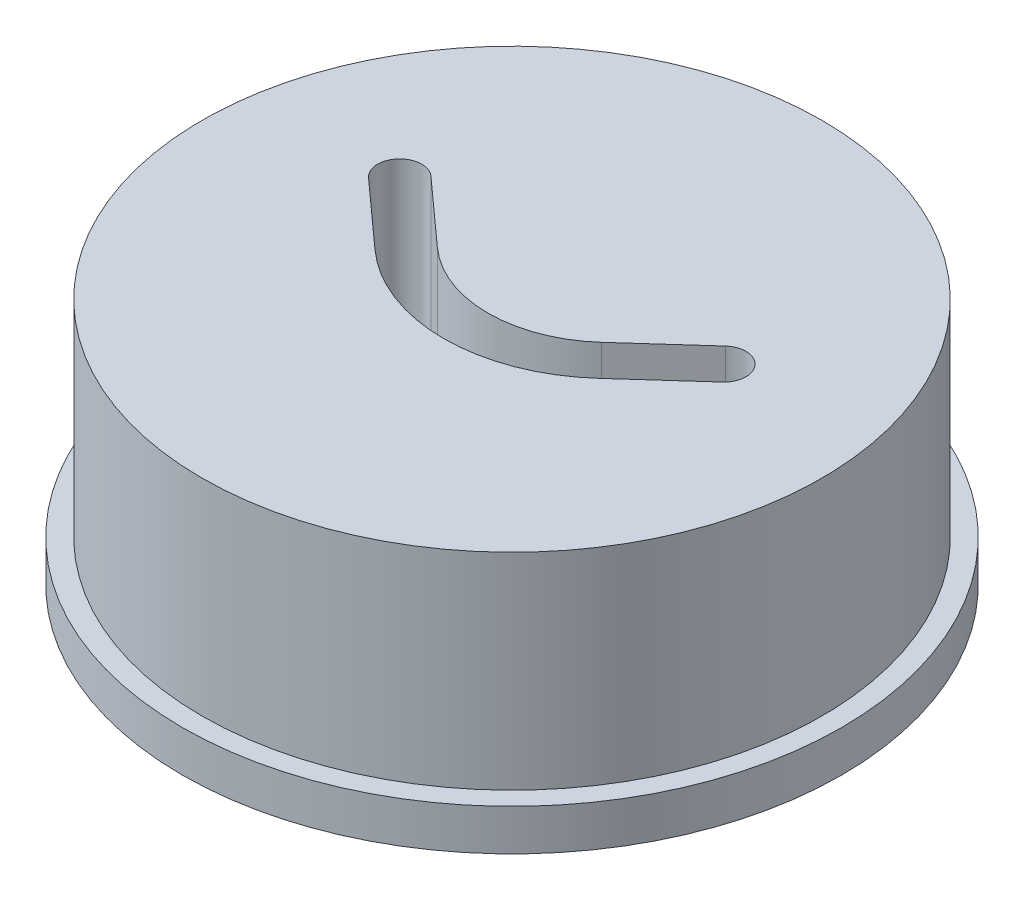
ISO-10303-21;
HEADER;
FILE_DESCRIPTION(('STEP AP214'),'2;1');
FILE_NAME('part.step','',(''),(''),'','','');
FILE_SCHEMA(('AUTOMOTIVE_DESIGN { 1 0 10303 214 1 1 1 1 }'));
ENDSEC;
DATA;
#1=APPLICATION_CONTEXT('core data for automotive mechanical design processes');
#2=APPLICATION_PROTOCOL_DEFINITION('international standard','automotive_design',2000,#1);
#3=PRODUCT_CONTEXT('',#1,'mechanical');
#4=PRODUCT('Part','Part','',(#3));
#5=PRODUCT_RELATED_PRODUCT_CATEGORY('part','',(#4));
#6=PRODUCT_DEFINITION_FORMATION('','',#4);
#7=PRODUCT_DEFINITION_CONTEXT('part definition',#1,'design');
#8=PRODUCT_DEFINITION('design','',#6,#7);
#9=PRODUCT_DEFINITION_SHAPE('','',#8);
#10=(LENGTH_UNIT() NAMED_UNIT(*) SI_UNIT(.MILLI.,.METRE.));
#11=(NAMED_UNIT(*) PLANE_ANGLE_UNIT() SI_UNIT($,.RADIAN.));
#12=(NAMED_UNIT(*) SI_UNIT($,.STERADIAN.) SOLID_ANGLE_UNIT());
#13=UNCERTAINTY_MEASURE_WITH_UNIT(LENGTH_MEASURE(1.E-05),#10,'distance_accuracy_value','');
#14=(GEOMETRIC_REPRESENTATION_CONTEXT(3) GLOBAL_UNCERTAINTY_ASSIGNED_CONTEXT((#13)) GLOBAL_UNIT_ASSIGNED_CONTEXT((#10,
#11,#12)) REPRESENTATION_CONTEXT('',''));
#15=CARTESIAN_POINT('',(0.,0.,0.));
#16=DIRECTION('',(0.,0.,1.));
#17=DIRECTION('',(1.,0.,0.));
#18=AXIS2_PLACEMENT_3D('',#15,#16,#17);
#19=CARTESIAN_POINT('',(0.,19.05,0.));
#20=DIRECTION('',(0.,-1.,0.));
#21=DIRECTION('',(0.,0.,-1.));
#22=AXIS2_PLACEMENT_3D('',#19,#20,#21);
#23=CYLINDRICAL_SURFACE('',#22,23.876);
#24=CARTESIAN_POINT('',(0.,19.05,0.));
#25=DIRECTION('',(0.,1.,0.));
#26=DIRECTION('',(0.,0.,1.));
#27=AXIS2_PLACEMENT_3D('',#24,#25,#26);
#28=CIRCLE('',#27,23.876);
#29=CARTESIAN_POINT('',(0.,19.05,-23.876));
#30=VERTEX_POINT('',#29);
#31=EDGE_CURVE('E282',#30,#30,#28,.T.);
#32=CARTESIAN_POINT('',(0.,3.175,0.));
#33=DIRECTION('',(0.,-1.,0.));
#34=DIRECTION('',(0.,0.,-1.));
#35=AXIS2_PLACEMENT_3D('',#32,#33,#34);
#36=CIRCLE('',#35,23.876);
#37=CARTESIAN_POINT('',(0.,3.175,-23.876));
#38=VERTEX_POINT('',#37);
#39=EDGE_CURVE('E11',#38,#38,#36,.T.);
#40=CARTESIAN_POINT('',(0.,19.05,-23.876));
#41=CARTESIAN_POINT('',(0.,18.8846354166667,-23.876));
#42=CARTESIAN_POINT('',(0.,18.7192708333333,-23.876));
#43=CARTESIAN_POINT('',(0.,18.3885416666667,-23.876));
#44=CARTESIAN_POINT('',(0.,18.2231770833333,-23.876));
#45=CARTESIAN_POINT('',(0.,17.8924479166667,-23.876));
#46=CARTESIAN_POINT('',(0.,17.7270833333333,-23.876));
#47=CARTESIAN_POINT('',(0.,17.3963541666667,-23.876));
#48=CARTESIAN_POINT('',(0.,17.2309895833333,-23.876));
#49=CARTESIAN_POINT('',(0.,16.9002604166667,-23.876));
#50=CARTESIAN_POINT('',(0.,16.7348958333333,-23.876));
#51=CARTESIAN_POINT('',(0.,16.4041666666667,-23.876));
#52=CARTESIAN_POINT('',(0.,16.2388020833333,-23.876));
#53=CARTESIAN_POINT('',(0.,15.9080729166667,-23.876));
#54=CARTESIAN_POINT('',(0.,15.7427083333333,-23.876));
#55=CARTESIAN_POINT('',(0.,15.4119791666667,-23.876));
#56=CARTESIAN_POINT('',(0.,15.2466145833333,-23.876));
#57=CARTESIAN_POINT('',(0.,14.9158854166667,-23.876));
#58=CARTESIAN_POINT('',(0.,14.7505208333333,-23.876));
#59=CARTESIAN_POINT('',(0.,14.4197916666667,-23.876));
#60=CARTESIAN_POINT('',(0.,14.2544270833333,-23.876));
#61=CARTESIAN_POINT('',(0.,13.9236979166667,-23.876));
#62=CARTESIAN_POINT('',(0.,13.7583333333333,-23.876));
#63=CARTESIAN_POINT('',(0.,13.4276041666667,-23.876));
#64=CARTESIAN_POINT('',(0.,13.2622395833333,-23.876));
#65=CARTESIAN_POINT('',(0.,12.9315104166667,-23.876));
#66=CARTESIAN_POINT('',(0.,12.7661458333333,-23.876));
#67=CARTESIAN_POINT('',(0.,12.4354166666667,-23.876));
#68=CARTESIAN_POINT('',(0.,12.2700520833333,-23.876));
#69=CARTESIAN_POINT('',(0.,11.9393229166667,-23.876));
#70=CARTESIAN_POINT('',(0.,11.7739583333333,-23.876));
#71=CARTESIAN_POINT('',(0.,11.4432291666667,-23.876));
#72=CARTESIAN_POINT('',(0.,11.2778645833333,-23.876));
#73=CARTESIAN_POINT('',(0.,10.9471354166667,-23.876));
#74=CARTESIAN_POINT('',(0.,10.7817708333333,-23.876));
#75=CARTESIAN_POINT('',(0.,10.4510416666667,-23.876));
#76=CARTESIAN_POINT('',(0.,10.2856770833333,-23.876));
#77=CARTESIAN_POINT('',(0.,9.95494791666667,-23.876));
#78=CARTESIAN_POINT('',(0.,9.78958333333334,-23.876));
#79=CARTESIAN_POINT('',(0.,9.45885416666667,-23.876));
#80=CARTESIAN_POINT('',(0.,9.29348958333334,-23.876));
#81=CARTESIAN_POINT('',(0.,8.96276041666667,-23.876));
#82=CARTESIAN_POINT('',(0.,8.79739583333334,-23.876));
#83=CARTESIAN_POINT('',(0.,8.46666666666667,-23.876));
#84=CARTESIAN_POINT('',(0.,8.30130208333334,-23.876));
#85=CARTESIAN_POINT('',(0.,7.97057291666667,-23.876));
#86=CARTESIAN_POINT('',(0.,7.80520833333334,-23.876));
#87=CARTESIAN_POINT('',(0.,7.47447916666667,-23.876));
#88=CARTESIAN_POINT('',(0.,7.30911458333334,-23.876));
#89=CARTESIAN_POINT('',(0.,6.97838541666667,-23.876));
#90=CARTESIAN_POINT('',(0.,6.81302083333334,-23.876));
#91=CARTESIAN_POINT('',(0.,6.48229166666667,-23.876));
#92=CARTESIAN_POINT('',(0.,6.31692708333334,-23.876));
#93=CARTESIAN_POINT('',(0.,5.98619791666667,-23.876));
#94=CARTESIAN_POINT('',(0.,5.82083333333334,-23.876));
#95=CARTESIAN_POINT('',(0.,5.49010416666667,-23.876));
#96=CARTESIAN_POINT('',(0.,5.32473958333334,-23.876));
#97=CARTESIAN_POINT('',(0.,4.99401041666667,-23.876));
#98=CARTESIAN_POINT('',(0.,4.82864583333334,-23.876));
#99=CARTESIAN_POINT('',(0.,4.49791666666667,-23.876));
#100=CARTESIAN_POINT('',(0.,4.33255208333334,-23.876));
#101=CARTESIAN_POINT('',(0.,4.00182291666667,-23.876));
#102=CARTESIAN_POINT('',(0.,3.83645833333334,-23.876));
#103=CARTESIAN_POINT('',(0.,3.50572916666667,-23.876));
#104=CARTESIAN_POINT('',(0.,3.34036458333334,-23.876));
#105=CARTESIAN_POINT('',(0.,3.175,-23.876));
#106=B_SPLINE_CURVE_WITH_KNOTS('',3,(#40,#41,#42,#43,#44,#45,#46,#47,#48,#49,#50,#51,#52,#53,
#54,#55,#56,#57,#58,#59,#60,#61,#62,#63,#64,#65,#66,#67,#68,#69,#70,#71,#72,#73,#74,#75,#76,#77,
#78,#79,#80,#81,#82,#83,#84,#85,#86,#87,#88,#89,#90,#91,#92,#93,#94,#95,#96,#97,#98,#99,#100,
#101,#102,#103,#104,#105),.UNSPECIFIED.,.F.,.F.,(4,2,2,2,2,2,2,2,2,2,2,2,2,2,2,2,2,2,2,2,2,2,2,
2,2,2,2,2,2,2,2,2,4),(0.,0.496093749999999,0.992187499999998,1.48828125,1.984375,2.48046875,
2.9765625,3.47265625,3.96875,4.46484375,4.9609375,5.45703125,5.953125,6.44921875,
6.94531249999999,7.44140625,7.93749999999999,8.43359374999999,8.92968749999999,9.42578124999999,
9.92187499999999,10.41796875,10.9140625,11.41015625,11.90625,12.40234375,12.8984375,13.39453125,
13.890625,14.38671875,14.8828125,15.37890625,15.875),.UNSPECIFIED.);
#107=EDGE_CURVE('BSEAM37',#30,#38,#106,.T.);
#108=ORIENTED_EDGE('',*,*,#31,.F.);
#109=ORIENTED_EDGE('',*,*,#39,.F.);
#110=ORIENTED_EDGE('',*,*,#107,.T.);
#111=ORIENTED_EDGE('',*,*,#107,.F.);
#112=EDGE_LOOP('',(#108,#110,#109,#111));
#113=FACE_BOUND('',#112,.T.);
#114=ADVANCED_FACE('F37',(#113),#23,.T.);
#115=CARTESIAN_POINT('',(-12.4859182363819,19.05,-3.83545340078554));
#116=DIRECTION('',(0.,-1.,0.));
#117=DIRECTION('',(0.,0.,-1.));
#118=AXIS2_PLACEMENT_3D('',#115,#116,#117);
#119=CYLINDRICAL_SURFACE('',#118,0.889000000000001);
#120=CARTESIAN_POINT('',(-12.4859182363819,0.,-3.83545340078554));
#121=DIRECTION('',(0.,1.,0.));
#122=DIRECTION('',(0.,0.,-1.));
#123=AXIS2_PLACEMENT_3D('',#120,#121,#122);
#124=CIRCLE('',#123,0.889000000000001);
#125=CARTESIAN_POINT('',(-11.8908364727639,0.,-4.49590680157107));
#126=VERTEX_POINT('',#125);
#127=CARTESIAN_POINT('',(-13.081,0.,-3.175));
#128=VERTEX_POINT('',#127);
#129=EDGE_CURVE('E242',#126,#128,#124,.T.);
#130=ORIENTED_EDGE('',*,*,#129,.F.);
#131=DIRECTION('',(0.,-1.,0.));
#132=VECTOR('',#131,1.);
#133=CARTESIAN_POINT('',(-11.8908364727638,19.05,-4.49590680157107));
#134=LINE('',#133,#132);
#135=CARTESIAN_POINT('',(-11.8908364727638,6.35,-4.49590680157107));
#136=VERTEX_POINT('',#135);
#137=EDGE_CURVE('E266',#136,#126,#134,.T.);
#138=ORIENTED_EDGE('',*,*,#137,.F.);
#139=CARTESIAN_POINT('',(-12.4859182363819,6.35,-3.83545340078554));
#140=DIRECTION('',(0.,1.,0.));
#141=DIRECTION('',(0.,0.,1.));
#142=AXIS2_PLACEMENT_3D('',#139,#140,#141);
#143=CIRCLE('',#142,0.889000000000001);
#144=CARTESIAN_POINT('',(-13.081,6.35,-3.175));
#145=VERTEX_POINT('',#144);
#146=EDGE_CURVE('E59',#136,#145,#143,.T.);
#147=ORIENTED_EDGE('',*,*,#146,.T.);
#148=DIRECTION('',(0.,-1.,0.));
#149=VECTOR('',#148,1.);
#150=CARTESIAN_POINT('',(-13.081,19.05,-3.175));
#151=LINE('',#150,#149);
#152=EDGE_CURVE('E280',#145,#128,#151,.T.);
#153=ORIENTED_EDGE('',*,*,#152,.T.);
#154=EDGE_LOOP('',(#130,#138,#147,#153));
#155=FACE_BOUND('',#154,.T.);
#156=ADVANCED_FACE('F291',(#155),#119,.F.);
#157=CARTESIAN_POINT('',(-13.081,19.05,-3.175));
#158=DIRECTION('',(0.66938331115646,0.,-0.742917211232324));
#159=DIRECTION('',(-0.742917211232324,0.,-0.66938331115646));
#160=AXIS2_PLACEMENT_3D('',#157,#158,#159);
#161=PLANE('',#160);
#162=DIRECTION('',(0.742917211232324,0.,0.66938331115646));
#163=VECTOR('',#162,1.);
#164=CARTESIAN_POINT('',(-13.081,0.,-3.175));
#165=LINE('',#164,#163);
#166=CARTESIAN_POINT('',(-8.05910731299933,0.,1.34982605635276));
#167=VERTEX_POINT('',#166);
#168=EDGE_CURVE('E245',#128,#167,#165,.T.);
#169=ORIENTED_EDGE('',*,*,#168,.F.);
#170=ORIENTED_EDGE('',*,*,#152,.F.);
#171=DIRECTION('',(0.742917211232324,0.,0.66938331115646));
#172=VECTOR('',#171,1.);
#173=CARTESIAN_POINT('',(-13.081,6.35,-3.175));
#174=LINE('',#173,#172);
#175=CARTESIAN_POINT('',(-8.05910731299933,6.35,1.34982605635276));
#176=VERTEX_POINT('',#175);
#177=EDGE_CURVE('E238',#145,#176,#174,.T.);
#178=ORIENTED_EDGE('',*,*,#177,.T.);
#179=DIRECTION('',(0.,-1.,0.));
#180=VECTOR('',#179,1.);
#181=CARTESIAN_POINT('',(-8.05910731299933,19.05,1.34982605635276));
#182=LINE('',#181,#180);
#183=EDGE_CURVE('E278',#176,#167,#182,.T.);
#184=ORIENTED_EDGE('',*,*,#183,.T.);
#185=EDGE_LOOP('',(#169,#170,#178,#184));
#186=FACE_BOUND('',#185,.T.);
#187=ADVANCED_FACE('F318',(#186),#161,.T.);
#188=CARTESIAN_POINT('',(0.,19.05,-7.59459999999993));
#189=DIRECTION('',(0.,-1.,0.));
#190=DIRECTION('',(0.,0.,-1.));
#191=AXIS2_PLACEMENT_3D('',#188,#189,#190);
#192=CYLINDRICAL_SURFACE('',#191,12.0396);
#193=CARTESIAN_POINT('',(0.,0.,-7.59459999999993));
#194=DIRECTION('',(0.,1.,0.));
#195=DIRECTION('',(0.,0.,1.));
#196=AXIS2_PLACEMENT_3D('',#193,#194,#195);
#197=CIRCLE('',#196,12.0396);
#198=CARTESIAN_POINT('',(8.05910731299933,0.,1.34982605635276));
#199=VERTEX_POINT('',#198);
#200=EDGE_CURVE('E248',#167,#199,#197,.T.);
#201=ORIENTED_EDGE('',*,*,#200,.F.);
#202=ORIENTED_EDGE('',*,*,#183,.F.);
#203=CARTESIAN_POINT('',(0.,6.35,-7.59459999999993));
#204=DIRECTION('',(0.,1.,0.));
#205=DIRECTION('',(0.,0.,1.));
#206=AXIS2_PLACEMENT_3D('',#203,#204,#205);
#207=CIRCLE('',#206,12.0396);
#208=CARTESIAN_POINT('',(8.05910731299933,6.35,1.34982605635276));
#209=VERTEX_POINT('',#208);
#210=EDGE_CURVE('E235',#176,#209,#207,.T.);
#211=ORIENTED_EDGE('',*,*,#210,.T.);
#212=DIRECTION('',(0.,-1.,0.));
#213=VECTOR('',#212,1.);
#214=CARTESIAN_POINT('',(8.05910731299933,19.05,1.34982605635276));
#215=LINE('',#214,#213);
#216=EDGE_CURVE('E276',#209,#199,#215,.T.);
#217=ORIENTED_EDGE('',*,*,#216,.T.);
#218=EDGE_LOOP('',(#201,#202,#211,#217));
#219=FACE_BOUND('',#218,.T.);
#220=ADVANCED_FACE('F315',(#219),#192,.F.);
#221=CARTESIAN_POINT('',(13.081,19.05,-3.175));
#222=DIRECTION('',(-0.66938331115646,0.,-0.742917211232324));
#223=DIRECTION('',(-0.742917211232324,0.,0.66938331115646));
#224=AXIS2_PLACEMENT_3D('',#221,#222,#223);
#225=PLANE('',#224);
#226=DIRECTION('',(0.742917211232324,0.,-0.66938331115646));
#227=VECTOR('',#226,1.);
#228=CARTESIAN_POINT('',(13.081,0.,-3.175));
#229=LINE('',#228,#227);
#230=CARTESIAN_POINT('',(13.081,0.,-3.175));
#231=VERTEX_POINT('',#230);
#232=EDGE_CURVE('E251',#199,#231,#229,.T.);
#233=ORIENTED_EDGE('',*,*,#232,.F.);
#234=ORIENTED_EDGE('',*,*,#216,.F.);
#235=DIRECTION('',(0.742917211232324,0.,-0.66938331115646));
#236=VECTOR('',#235,1.);
#237=CARTESIAN_POINT('',(13.081,6.35,-3.175));
#238=LINE('',#237,#236);
#239=CARTESIAN_POINT('',(13.081,6.35,-3.175));
#240=VERTEX_POINT('',#239);
#241=EDGE_CURVE('E232',#209,#240,#238,.T.);
#242=ORIENTED_EDGE('',*,*,#241,.T.);
#243=DIRECTION('',(0.,-1.,0.));
#244=VECTOR('',#243,1.);
#245=CARTESIAN_POINT('',(13.081,19.05,-3.175));
#246=LINE('',#245,#244);
#247=EDGE_CURVE('E274',#240,#231,#246,.T.);
#248=ORIENTED_EDGE('',*,*,#247,.T.);
#249=EDGE_LOOP('',(#233,#234,#242,#248));
#250=FACE_BOUND('',#249,.T.);
#251=ADVANCED_FACE('F312',(#250),#225,.T.);
#252=CARTESIAN_POINT('',(12.4859182363819,19.05,-3.83545340078554));
#253=DIRECTION('',(0.,-1.,0.));
#254=DIRECTION('',(0.,0.,-1.));
#255=AXIS2_PLACEMENT_3D('',#252,#253,#254);
#256=CYLINDRICAL_SURFACE('',#255,0.889000000000001);
#257=CARTESIAN_POINT('',(12.4859182363819,0.,-3.83545340078554));
#258=DIRECTION('',(0.,1.,0.));
#259=DIRECTION('',(0.,0.,-1.));
#260=AXIS2_PLACEMENT_3D('',#257,#258,#259);
#261=CIRCLE('',#260,0.889000000000001);
#262=CARTESIAN_POINT('',(11.8908364727638,0.,-4.49590680157107));
#263=VERTEX_POINT('',#262);
#264=EDGE_CURVE('E254',#231,#263,#261,.T.);
#265=ORIENTED_EDGE('',*,*,#264,.F.);
#266=ORIENTED_EDGE('',*,*,#247,.F.);
#267=CARTESIAN_POINT('',(12.4859182363819,6.35,-3.83545340078554));
#268=DIRECTION('',(0.,1.,0.));
#269=DIRECTION('',(0.,0.,1.));
#270=AXIS2_PLACEMENT_3D('',#267,#268,#269);
#271=CIRCLE('',#270,0.889000000000001);
#272=CARTESIAN_POINT('',(11.8908364727638,6.35,-4.49590680157107));
#273=VERTEX_POINT('',#272);
#274=EDGE_CURVE('E229',#240,#273,#271,.T.);
#275=ORIENTED_EDGE('',*,*,#274,.T.);
#276=DIRECTION('',(0.,-1.,0.));
#277=VECTOR('',#276,1.);
#278=CARTESIAN_POINT('',(11.8908364727638,19.05,-4.49590680157107));
#279=LINE('',#278,#277);
#280=EDGE_CURVE('E272',#273,#263,#279,.T.);
#281=ORIENTED_EDGE('',*,*,#280,.T.);
#282=EDGE_LOOP('',(#265,#266,#275,#281));
#283=FACE_BOUND('',#282,.T.);
#284=ADVANCED_FACE('F307',(#283),#256,.F.);
#285=CARTESIAN_POINT('',(11.8908364727638,19.05,-4.49590680157107));
#286=DIRECTION('',(0.66938331115646,0.,0.742917211232324));
#287=DIRECTION('',(0.742917211232324,0.,-0.66938331115646));
#288=AXIS2_PLACEMENT_3D('',#285,#286,#287);
#289=PLANE('',#288);
#290=DIRECTION('',(-0.742917211232324,0.,0.66938331115646));
#291=VECTOR('',#290,1.);
#292=CARTESIAN_POINT('',(11.8908364727638,0.,-4.49590680157107));
#293=LINE('',#292,#291);
#294=CARTESIAN_POINT('',(6.86894378576314,0.,0.0289192547816858));
#295=VERTEX_POINT('',#294);
#296=EDGE_CURVE('E257',#263,#295,#293,.T.);
#297=ORIENTED_EDGE('',*,*,#296,.F.);
#298=ORIENTED_EDGE('',*,*,#280,.F.);
#299=DIRECTION('',(-0.742917211232324,0.,0.66938331115646));
#300=VECTOR('',#299,1.);
#301=CARTESIAN_POINT('',(11.8908364727638,6.35,-4.49590680157107));
#302=LINE('',#301,#300);
#303=CARTESIAN_POINT('',(6.86894378576314,6.35,0.0289192547816858));
#304=VERTEX_POINT('',#303);
#305=EDGE_CURVE('E226',#273,#304,#302,.T.);
#306=ORIENTED_EDGE('',*,*,#305,.T.);
#307=DIRECTION('',(0.,-1.,0.));
#308=VECTOR('',#307,1.);
#309=CARTESIAN_POINT('',(6.86894378576314,19.05,0.0289192547816858));
#310=LINE('',#309,#308);
#311=EDGE_CURVE('E270',#304,#295,#310,.T.);
#312=ORIENTED_EDGE('',*,*,#311,.T.);
#313=EDGE_LOOP('',(#297,#298,#306,#312));
#314=FACE_BOUND('',#313,.T.);
#315=ADVANCED_FACE('F304',(#314),#289,.T.);
#316=CARTESIAN_POINT('',(0.,19.05,-7.59459999999993));
#317=DIRECTION('',(0.,-1.,0.));
#318=DIRECTION('',(0.,0.,-1.));
#319=AXIS2_PLACEMENT_3D('',#316,#317,#318);
#320=CYLINDRICAL_SURFACE('',#319,10.2616);
#321=CARTESIAN_POINT('',(0.,0.,-7.59459999999993));
#322=DIRECTION('',(0.,-1.,0.));
#323=DIRECTION('',(0.,0.,1.));
#324=AXIS2_PLACEMENT_3D('',#321,#322,#323);
#325=CIRCLE('',#324,10.2616);
#326=CARTESIAN_POINT('',(-6.86894378576314,0.,0.0289192547816876));
#327=VERTEX_POINT('',#326);
#328=EDGE_CURVE('E260',#295,#327,#325,.T.);
#329=ORIENTED_EDGE('',*,*,#328,.F.);
#330=ORIENTED_EDGE('',*,*,#311,.F.);
#331=CARTESIAN_POINT('',(0.,6.35,-7.59459999999993));
#332=DIRECTION('',(0.,1.,0.));
#333=DIRECTION('',(0.,0.,1.));
#334=AXIS2_PLACEMENT_3D('',#331,#332,#333);
#335=CIRCLE('',#334,10.2616);
#336=CARTESIAN_POINT('',(-6.86894378576314,6.35,0.0289192547816867));
#337=VERTEX_POINT('',#336);
#338=EDGE_CURVE('E212',#304,#337,#335,.F.);
#339=ORIENTED_EDGE('',*,*,#338,.T.);
#340=DIRECTION('',(0.,-1.,0.));
#341=VECTOR('',#340,1.);
#342=CARTESIAN_POINT('',(-6.86894378576314,19.05,0.0289192547816876));
#343=LINE('',#342,#341);
#344=EDGE_CURVE('E268',#337,#327,#343,.T.);
#345=ORIENTED_EDGE('',*,*,#344,.T.);
#346=EDGE_LOOP('',(#329,#330,#339,#345));
#347=FACE_BOUND('',#346,.T.);
#348=ADVANCED_FACE('F301',(#347),#320,.T.);
#349=CARTESIAN_POINT('',(-11.8908364727638,19.05,-4.49590680157107));
#350=DIRECTION('',(-0.669383311156461,0.,0.742917211232324));
#351=DIRECTION('',(0.742917211232324,0.,0.669383311156461));
#352=AXIS2_PLACEMENT_3D('',#349,#350,#351);
#353=PLANE('',#352);
#354=DIRECTION('',(-0.742917211232324,0.,-0.669383311156461));
#355=VECTOR('',#354,1.);
#356=CARTESIAN_POINT('',(-11.8908364727638,0.,-4.49590680157107));
#357=LINE('',#356,#355);
#358=EDGE_CURVE('E263',#327,#126,#357,.T.);
#359=ORIENTED_EDGE('',*,*,#358,.F.);
#360=ORIENTED_EDGE('',*,*,#344,.F.);
#361=DIRECTION('',(-0.742917211232324,0.,-0.669383311156461));
#362=VECTOR('',#361,1.);
#363=CARTESIAN_POINT('',(-11.8908364727638,6.35,-4.49590680157107));
#364=LINE('',#363,#362);
#365=EDGE_CURVE('E44',#337,#136,#364,.T.);
#366=ORIENTED_EDGE('',*,*,#365,.T.);
#367=ORIENTED_EDGE('',*,*,#137,.T.);
#368=EDGE_LOOP('',(#359,#360,#366,#367));
#369=FACE_BOUND('',#368,.T.);
#370=ADVANCED_FACE('F288',(#369),#353,.T.);
#371=CARTESIAN_POINT('',(0.,19.05,0.));
#372=DIRECTION('',(0.,1.,0.));
#373=DIRECTION('',(0.,0.,1.));
#374=AXIS2_PLACEMENT_3D('',#371,#372,#373);
#375=PLANE('',#374);
#376=CARTESIAN_POINT('',(12.4859182363819,19.05,-3.83545340078554));
#377=DIRECTION('',(0.,1.,0.));
#378=DIRECTION('',(0.,0.,1.));
#379=AXIS2_PLACEMENT_3D('',#376,#377,#378);
#380=CIRCLE('',#379,1.7018);
#381=CARTESIAN_POINT('',(13.625074755308,19.05,-2.57115689071037));
#382=VERTEX_POINT('',#381);
#383=CARTESIAN_POINT('',(11.3467617174559,19.05,-5.09974991086071));
#384=VERTEX_POINT('',#383);
#385=EDGE_CURVE('E51',#382,#384,#380,.T.);
#386=ORIENTED_EDGE('',*,*,#385,.F.);
#387=DIRECTION('',(0.742917211232324,0.,-0.66938331115646));
#388=VECTOR('',#387,1.);
#389=CARTESIAN_POINT('',(8.6031820683073,19.05,1.95366916564239));
#390=LINE('',#389,#388);
#391=CARTESIAN_POINT('',(8.6031820683073,19.05,1.95366916564239));
#392=VERTEX_POINT('',#391);
#393=EDGE_CURVE('E170',#392,#382,#390,.T.);
#394=ORIENTED_EDGE('',*,*,#393,.F.);
#395=CARTESIAN_POINT('',(0.,19.05,-7.59459999999993));
#396=DIRECTION('',(0.,1.,0.));
#397=DIRECTION('',(0.,0.,1.));
#398=AXIS2_PLACEMENT_3D('',#395,#396,#397);
#399=CIRCLE('',#398,12.8524);
#400=CARTESIAN_POINT('',(-8.6031820683073,19.05,1.95366916564239));
#401=VERTEX_POINT('',#400);
#402=EDGE_CURVE('E173',#401,#392,#399,.T.);
#403=ORIENTED_EDGE('',*,*,#402,.F.);
#404=DIRECTION('',(0.742917211232324,0.,0.66938331115646));
#405=VECTOR('',#404,1.);
#406=CARTESIAN_POINT('',(-13.625074755308,19.05,-2.57115689071037));
#407=LINE('',#406,#405);
#408=CARTESIAN_POINT('',(-13.625074755308,19.05,-2.57115689071037));
#409=VERTEX_POINT('',#408);
#410=EDGE_CURVE('E205',#409,#401,#407,.T.);
#411=ORIENTED_EDGE('',*,*,#410,.F.);
#412=CARTESIAN_POINT('',(-12.4859182363819,19.05,-3.83545340078554));
#413=DIRECTION('',(0.,1.,0.));
#414=DIRECTION('',(0.,0.,1.));
#415=AXIS2_PLACEMENT_3D('',#412,#413,#414);
#416=CIRCLE('',#415,1.7018);
#417=CARTESIAN_POINT('',(-11.3467617174559,19.05,-5.09974991086071));
#418=VERTEX_POINT('',#417);
#419=EDGE_CURVE('E202',#418,#409,#416,.T.);
#420=ORIENTED_EDGE('',*,*,#419,.F.);
#421=DIRECTION('',(-0.742917211232324,0.,-0.669383311156461));
#422=VECTOR('',#421,1.);
#423=CARTESIAN_POINT('',(-6.32486903045517,19.05,-0.574923854507948));
#424=LINE('',#423,#422);
#425=CARTESIAN_POINT('',(-6.32486903045517,19.05,-0.574923854507948));
#426=VERTEX_POINT('',#425);
#427=EDGE_CURVE('E199',#426,#418,#424,.T.);
#428=ORIENTED_EDGE('',*,*,#427,.F.);
#429=CARTESIAN_POINT('',(0.,19.05,-7.59459999999993));
#430=DIRECTION('',(0.,-1.,0.));
#431=DIRECTION('',(0.,0.,1.));
#432=AXIS2_PLACEMENT_3D('',#429,#430,#431);
#433=CIRCLE('',#432,9.44880000000001);
#434=CARTESIAN_POINT('',(6.32486903045518,19.05,-0.574923854507948));
#435=VERTEX_POINT('',#434);
#436=EDGE_CURVE('E196',#435,#426,#433,.T.);
#437=ORIENTED_EDGE('',*,*,#436,.F.);
#438=DIRECTION('',(-0.742917211232324,0.,0.669383311156461));
#439=VECTOR('',#438,1.);
#440=CARTESIAN_POINT('',(11.3467617174559,19.05,-5.09974991086071));
#441=LINE('',#440,#439);
#442=EDGE_CURVE('E193',#384,#435,#441,.T.);
#443=ORIENTED_EDGE('',*,*,#442,.F.);
#444=EDGE_LOOP('',(#386,#394,#403,#411,#420,#428,#437,#443));
#445=FACE_BOUND('',#444,.T.);
#446=ORIENTED_EDGE('',*,*,#31,.T.);
#447=EDGE_LOOP('',(#446));
#448=FACE_BOUND('',#447,.T.);
#449=ADVANCED_FACE('F383',(#445,#448),#375,.T.);
#450=CARTESIAN_POINT('',(0.,0.,0.));
#451=DIRECTION('',(0.,1.,0.));
#452=DIRECTION('',(0.,0.,1.));
#453=AXIS2_PLACEMENT_3D('',#450,#451,#452);
#454=PLANE('',#453);
#455=ORIENTED_EDGE('',*,*,#129,.T.);
#456=ORIENTED_EDGE('',*,*,#168,.T.);
#457=ORIENTED_EDGE('',*,*,#200,.T.);
#458=ORIENTED_EDGE('',*,*,#232,.T.);
#459=ORIENTED_EDGE('',*,*,#264,.T.);
#460=ORIENTED_EDGE('',*,*,#296,.T.);
#461=ORIENTED_EDGE('',*,*,#328,.T.);
#462=ORIENTED_EDGE('',*,*,#358,.T.);
#463=EDGE_LOOP('',(#455,#456,#457,#458,#459,#460,#461,#462));
#464=FACE_BOUND('',#463,.T.);
#465=CARTESIAN_POINT('',(0.,0.,0.));
#466=DIRECTION('',(0.,-1.,0.));
#467=DIRECTION('',(0.,0.,-1.));
#468=AXIS2_PLACEMENT_3D('',#465,#466,#467);
#469=CIRCLE('',#468,25.4);
#470=CARTESIAN_POINT('',(0.,0.,-25.4));
#471=VERTEX_POINT('',#470);
#472=EDGE_CURVE('E176',#471,#471,#469,.T.);
#473=ORIENTED_EDGE('',*,*,#472,.T.);
#474=EDGE_LOOP('',(#473));
#475=FACE_BOUND('',#474,.T.);
#476=ADVANCED_FACE('F295',(#464,#475),#454,.F.);
#477=CARTESIAN_POINT('',(12.4859182363819,6.35,-3.83545340078554));
#478=DIRECTION('',(0.,1.,0.));
#479=DIRECTION('',(0.,0.,1.));
#480=AXIS2_PLACEMENT_3D('',#477,#478,#479);
#481=CYLINDRICAL_SURFACE('',#480,1.7018);
#482=ORIENTED_EDGE('',*,*,#385,.T.);
#483=DIRECTION('',(0.,1.,0.));
#484=VECTOR('',#483,1.);
#485=CARTESIAN_POINT('',(11.3467617174559,6.35,-5.09974991086071));
#486=LINE('',#485,#484);
#487=CARTESIAN_POINT('',(11.3467617174559,6.35,-5.09974991086071));
#488=VERTEX_POINT('',#487);
#489=EDGE_CURVE('E147',#488,#384,#486,.T.);
#490=ORIENTED_EDGE('',*,*,#489,.F.);
#491=CARTESIAN_POINT('',(12.4859182363819,6.35,-3.83545340078554));
#492=DIRECTION('',(0.,1.,0.));
#493=DIRECTION('',(0.,0.,1.));
#494=AXIS2_PLACEMENT_3D('',#491,#492,#493);
#495=CIRCLE('',#494,1.7018);
#496=CARTESIAN_POINT('',(13.625074755308,6.35,-2.57115689071037));
#497=VERTEX_POINT('',#496);
#498=EDGE_CURVE('E151',#497,#488,#495,.T.);
#499=ORIENTED_EDGE('',*,*,#498,.F.);
#500=DIRECTION('',(0.,1.,0.));
#501=VECTOR('',#500,1.);
#502=CARTESIAN_POINT('',(13.625074755308,6.35,-2.57115689071037));
#503=LINE('',#502,#501);
#504=EDGE_CURVE('E210',#497,#382,#503,.T.);
#505=ORIENTED_EDGE('',*,*,#504,.T.);
#506=EDGE_LOOP('',(#482,#490,#499,#505));
#507=FACE_BOUND('',#506,.T.);
#508=ADVANCED_FACE('F149',(#507),#481,.F.);
#509=CARTESIAN_POINT('',(8.6031820683073,6.35,1.95366916564239));
#510=DIRECTION('',(0.66938331115646,0.,0.742917211232324));
#511=DIRECTION('',(0.742917211232324,0.,-0.66938331115646));
#512=AXIS2_PLACEMENT_3D('',#509,#510,#511);
#513=PLANE('',#512);
#514=ORIENTED_EDGE('',*,*,#393,.T.);
#515=ORIENTED_EDGE('',*,*,#504,.F.);
#516=DIRECTION('',(0.742917211232324,0.,-0.66938331115646));
#517=VECTOR('',#516,1.);
#518=CARTESIAN_POINT('',(8.6031820683073,6.35,1.95366916564239));
#519=LINE('',#518,#517);
#520=CARTESIAN_POINT('',(8.6031820683073,6.35,1.95366916564239));
#521=VERTEX_POINT('',#520);
#522=EDGE_CURVE('E157',#521,#497,#519,.T.);
#523=ORIENTED_EDGE('',*,*,#522,.F.);
#524=DIRECTION('',(0.,1.,0.));
#525=VECTOR('',#524,1.);
#526=CARTESIAN_POINT('',(8.6031820683073,6.35,1.95366916564239));
#527=LINE('',#526,#525);
#528=EDGE_CURVE('E213',#521,#392,#527,.T.);
#529=ORIENTED_EDGE('',*,*,#528,.T.);
#530=EDGE_LOOP('',(#514,#515,#523,#529));
#531=FACE_BOUND('',#530,.T.);
#532=ADVANCED_FACE('F353',(#531),#513,.F.);
#533=CARTESIAN_POINT('',(0.,6.35,-7.59459999999993));
#534=DIRECTION('',(0.,1.,0.));
#535=DIRECTION('',(0.,0.,1.));
#536=AXIS2_PLACEMENT_3D('',#533,#534,#535);
#537=CYLINDRICAL_SURFACE('',#536,12.8524);
#538=ORIENTED_EDGE('',*,*,#402,.T.);
#539=ORIENTED_EDGE('',*,*,#528,.F.);
#540=CARTESIAN_POINT('',(0.,6.35,-7.59459999999993));
#541=DIRECTION('',(0.,1.,0.));
#542=DIRECTION('',(0.,0.,1.));
#543=AXIS2_PLACEMENT_3D('',#540,#541,#542);
#544=CIRCLE('',#543,12.8524);
#545=CARTESIAN_POINT('',(-8.6031820683073,6.35,1.95366916564239));
#546=VERTEX_POINT('',#545);
#547=EDGE_CURVE('E189',#546,#521,#544,.T.);
#548=ORIENTED_EDGE('',*,*,#547,.F.);
#549=DIRECTION('',(0.,1.,0.));
#550=VECTOR('',#549,1.);
#551=CARTESIAN_POINT('',(-8.6031820683073,6.35,1.95366916564239));
#552=LINE('',#551,#550);
#553=EDGE_CURVE('E215',#546,#401,#552,.T.);
#554=ORIENTED_EDGE('',*,*,#553,.T.);
#555=EDGE_LOOP('',(#538,#539,#548,#554));
#556=FACE_BOUND('',#555,.T.);
#557=ADVANCED_FACE('F356',(#556),#537,.F.);
#558=CARTESIAN_POINT('',(-13.625074755308,6.35,-2.57115689071037));
#559=DIRECTION('',(-0.66938331115646,0.,0.742917211232324));
#560=DIRECTION('',(0.742917211232324,0.,0.66938331115646));
#561=AXIS2_PLACEMENT_3D('',#558,#559,#560);
#562=PLANE('',#561);
#563=ORIENTED_EDGE('',*,*,#410,.T.);
#564=ORIENTED_EDGE('',*,*,#553,.F.);
#565=DIRECTION('',(0.742917211232324,0.,0.66938331115646));
#566=VECTOR('',#565,1.);
#567=CARTESIAN_POINT('',(-13.625074755308,6.35,-2.57115689071037));
#568=LINE('',#567,#566);
#569=CARTESIAN_POINT('',(-13.625074755308,6.35,-2.57115689071037));
#570=VERTEX_POINT('',#569);
#571=EDGE_CURVE('E186',#570,#546,#568,.T.);
#572=ORIENTED_EDGE('',*,*,#571,.F.);
#573=DIRECTION('',(0.,1.,0.));
#574=VECTOR('',#573,1.);
#575=CARTESIAN_POINT('',(-13.625074755308,6.35,-2.57115689071037));
#576=LINE('',#575,#574);
#577=EDGE_CURVE('E217',#570,#409,#576,.T.);
#578=ORIENTED_EDGE('',*,*,#577,.T.);
#579=EDGE_LOOP('',(#563,#564,#572,#578));
#580=FACE_BOUND('',#579,.T.);
#581=ADVANCED_FACE('F360',(#580),#562,.F.);
#582=CARTESIAN_POINT('',(-12.4859182363819,6.35,-3.83545340078554));
#583=DIRECTION('',(0.,1.,0.));
#584=DIRECTION('',(0.,0.,1.));
#585=AXIS2_PLACEMENT_3D('',#582,#583,#584);
#586=CYLINDRICAL_SURFACE('',#585,1.7018);
#587=ORIENTED_EDGE('',*,*,#419,.T.);
#588=ORIENTED_EDGE('',*,*,#577,.F.);
#589=CARTESIAN_POINT('',(-12.4859182363819,6.35,-3.83545340078554));
#590=DIRECTION('',(0.,1.,0.));
#591=DIRECTION('',(0.,0.,1.));
#592=AXIS2_PLACEMENT_3D('',#589,#590,#591);
#593=CIRCLE('',#592,1.7018);
#594=CARTESIAN_POINT('',(-11.3467617174559,6.35,-5.09974991086071));
#595=VERTEX_POINT('',#594);
#596=EDGE_CURVE('E183',#595,#570,#593,.T.);
#597=ORIENTED_EDGE('',*,*,#596,.F.);
#598=DIRECTION('',(0.,1.,0.));
#599=VECTOR('',#598,1.);
#600=CARTESIAN_POINT('',(-11.3467617174559,6.35,-5.09974991086071));
#601=LINE('',#600,#599);
#602=EDGE_CURVE('E219',#595,#418,#601,.T.);
#603=ORIENTED_EDGE('',*,*,#602,.T.);
#604=EDGE_LOOP('',(#587,#588,#597,#603));
#605=FACE_BOUND('',#604,.T.);
#606=ADVANCED_FACE('F364',(#605),#586,.F.);
#607=CARTESIAN_POINT('',(-6.32486903045517,6.35,-0.574923854507948));
#608=DIRECTION('',(0.669383311156461,0.,-0.742917211232324));
#609=DIRECTION('',(-0.742917211232324,0.,-0.669383311156461));
#610=AXIS2_PLACEMENT_3D('',#607,#608,#609);
#611=PLANE('',#610);
#612=ORIENTED_EDGE('',*,*,#427,.T.);
#613=ORIENTED_EDGE('',*,*,#602,.F.);
#614=DIRECTION('',(-0.742917211232324,0.,-0.669383311156461));
#615=VECTOR('',#614,1.);
#616=CARTESIAN_POINT('',(-6.32486903045517,6.35,-0.574923854507948));
#617=LINE('',#616,#615);
#618=CARTESIAN_POINT('',(-6.32486903045517,6.35,-0.574923854507948));
#619=VERTEX_POINT('',#618);
#620=EDGE_CURVE('E180',#619,#595,#617,.T.);
#621=ORIENTED_EDGE('',*,*,#620,.F.);
#622=DIRECTION('',(0.,1.,0.));
#623=VECTOR('',#622,1.);
#624=CARTESIAN_POINT('',(-6.32486903045517,6.35,-0.574923854507948));
#625=LINE('',#624,#623);
#626=EDGE_CURVE('E221',#619,#426,#625,.T.);
#627=ORIENTED_EDGE('',*,*,#626,.T.);
#628=EDGE_LOOP('',(#612,#613,#621,#627));
#629=FACE_BOUND('',#628,.T.);
#630=ADVANCED_FACE('F368',(#629),#611,.F.);
#631=CARTESIAN_POINT('',(0.,6.35,-7.59459999999993));
#632=DIRECTION('',(0.,1.,0.));
#633=DIRECTION('',(0.,0.,1.));
#634=AXIS2_PLACEMENT_3D('',#631,#632,#633);
#635=CYLINDRICAL_SURFACE('',#634,9.44880000000001);
#636=ORIENTED_EDGE('',*,*,#436,.T.);
#637=ORIENTED_EDGE('',*,*,#626,.F.);
#638=CARTESIAN_POINT('',(0.,6.35,-7.59459999999993));
#639=DIRECTION('',(0.,-1.,0.));
#640=DIRECTION('',(0.,0.,1.));
#641=AXIS2_PLACEMENT_3D('',#638,#639,#640);
#642=CIRCLE('',#641,9.44880000000001);
#643=CARTESIAN_POINT('',(6.32486903045518,6.35,-0.574923854507948));
#644=VERTEX_POINT('',#643);
#645=EDGE_CURVE('E165',#644,#619,#642,.T.);
#646=ORIENTED_EDGE('',*,*,#645,.F.);
#647=DIRECTION('',(0.,1.,0.));
#648=VECTOR('',#647,1.);
#649=CARTESIAN_POINT('',(6.32486903045518,6.35,-0.574923854507948));
#650=LINE('',#649,#648);
#651=EDGE_CURVE('E156',#644,#435,#650,.T.);
#652=ORIENTED_EDGE('',*,*,#651,.T.);
#653=EDGE_LOOP('',(#636,#637,#646,#652));
#654=FACE_BOUND('',#653,.T.);
#655=ADVANCED_FACE('F372',(#654),#635,.T.);
#656=CARTESIAN_POINT('',(11.3467617174559,6.35,-5.09974991086071));
#657=DIRECTION('',(-0.669383311156461,0.,-0.742917211232324));
#658=DIRECTION('',(-0.742917211232324,0.,0.669383311156461));
#659=AXIS2_PLACEMENT_3D('',#656,#657,#658);
#660=PLANE('',#659);
#661=ORIENTED_EDGE('',*,*,#442,.T.);
#662=ORIENTED_EDGE('',*,*,#651,.F.);
#663=DIRECTION('',(-0.742917211232324,0.,0.669383311156461));
#664=VECTOR('',#663,1.);
#665=CARTESIAN_POINT('',(11.3467617174559,6.35,-5.09974991086071));
#666=LINE('',#665,#664);
#667=EDGE_CURVE('E160',#488,#644,#666,.T.);
#668=ORIENTED_EDGE('',*,*,#667,.F.);
#669=ORIENTED_EDGE('',*,*,#489,.T.);
#670=EDGE_LOOP('',(#661,#662,#668,#669));
#671=FACE_BOUND('',#670,.T.);
#672=ADVANCED_FACE('F161',(#671),#660,.F.);
#673=CARTESIAN_POINT('',(12.4859182363819,6.35,-3.83545340078554));
#674=DIRECTION('',(0.,1.,0.));
#675=DIRECTION('',(0.,0.,1.));
#676=AXIS2_PLACEMENT_3D('',#673,#674,#675);
#677=PLANE('',#676);
#678=ORIENTED_EDGE('',*,*,#365,.F.);
#679=ORIENTED_EDGE('',*,*,#338,.F.);
#680=ORIENTED_EDGE('',*,*,#305,.F.);
#681=ORIENTED_EDGE('',*,*,#274,.F.);
#682=ORIENTED_EDGE('',*,*,#241,.F.);
#683=ORIENTED_EDGE('',*,*,#210,.F.);
#684=ORIENTED_EDGE('',*,*,#177,.F.);
#685=ORIENTED_EDGE('',*,*,#146,.F.);
#686=EDGE_LOOP('',(#678,#679,#680,#681,#682,#683,#684,#685));
#687=FACE_BOUND('',#686,.T.);
#688=ORIENTED_EDGE('',*,*,#498,.T.);
#689=ORIENTED_EDGE('',*,*,#667,.T.);
#690=ORIENTED_EDGE('',*,*,#645,.T.);
#691=ORIENTED_EDGE('',*,*,#620,.T.);
#692=ORIENTED_EDGE('',*,*,#596,.T.);
#693=ORIENTED_EDGE('',*,*,#571,.T.);
#694=ORIENTED_EDGE('',*,*,#547,.T.);
#695=ORIENTED_EDGE('',*,*,#522,.T.);
#696=EDGE_LOOP('',(#688,#689,#690,#691,#692,#693,#694,#695));
#697=FACE_BOUND('',#696,.T.);
#698=ADVANCED_FACE('F167',(#687,#697),#677,.T.);
#699=CARTESIAN_POINT('',(0.,3.175,0.));
#700=DIRECTION('',(0.,-1.,0.));
#701=DIRECTION('',(0.,0.,-1.));
#702=AXIS2_PLACEMENT_3D('',#699,#700,#701);
#703=CYLINDRICAL_SURFACE('',#702,25.4);
#704=CARTESIAN_POINT('',(0.,3.175,0.));
#705=DIRECTION('',(0.,-1.,0.));
#706=DIRECTION('',(0.,0.,-1.));
#707=AXIS2_PLACEMENT_3D('',#704,#705,#706);
#708=CIRCLE('',#707,25.4);
#709=CARTESIAN_POINT('',(0.,3.175,-25.4));
#710=VERTEX_POINT('',#709);
#711=EDGE_CURVE('E194',#710,#710,#708,.T.);
#712=ORIENTED_EDGE('',*,*,#711,.T.);
#713=EDGE_LOOP('',(#712));
#714=FACE_BOUND('',#713,.T.);
#715=ORIENTED_EDGE('',*,*,#472,.F.);
#716=EDGE_LOOP('',(#715));
#717=FACE_BOUND('',#716,.T.);
#718=ADVANCED_FACE('F338',(#714,#717),#703,.T.);
#719=CARTESIAN_POINT('',(0.,3.175,0.));
#720=DIRECTION('',(0.,-1.,0.));
#721=DIRECTION('',(0.,0.,-1.));
#722=AXIS2_PLACEMENT_3D('',#719,#720,#721);
#723=PLANE('',#722);
#724=ORIENTED_EDGE('',*,*,#39,.T.);
#725=EDGE_LOOP('',(#724));
#726=FACE_BOUND('',#725,.T.);
#727=ORIENTED_EDGE('',*,*,#711,.F.);
#728=EDGE_LOOP('',(#727));
#729=FACE_BOUND('',#728,.T.);
#730=ADVANCED_FACE('F335',(#726,#729),#723,.F.);
#731=CLOSED_SHELL('',(#114,#156,#187,#220,#251,#284,#315,#348,#370,#449,#476,#508,#532,#557,
#581,#606,#630,#655,#672,#698,#718,#730));
#732=MANIFOLD_SOLID_BREP('B2',#731);
#733=ADVANCED_BREP_SHAPE_REPRESENTATION('',(#18,#732),#14);
#734=SHAPE_DEFINITION_REPRESENTATION(#9,#733);
ENDSEC;
END-ISO-10303-21;
